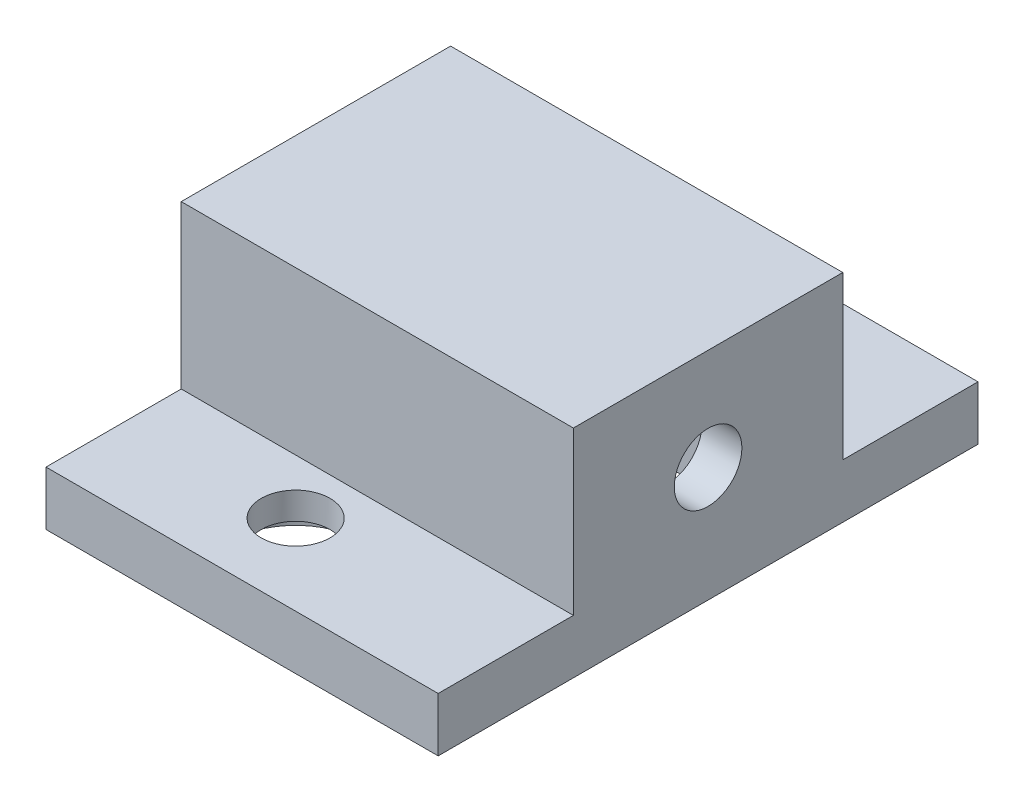
ISO-10303-21;
HEADER;
FILE_DESCRIPTION(('STEP AP214'),'2;1');
FILE_NAME('part.step','',(''),(''),'','','');
FILE_SCHEMA(('AUTOMOTIVE_DESIGN { 1 0 10303 214 1 1 1 1 }'));
ENDSEC;
DATA;
#1=APPLICATION_CONTEXT('core data for automotive mechanical design processes');
#2=APPLICATION_PROTOCOL_DEFINITION('international standard','automotive_design',2000,#1);
#3=PRODUCT_CONTEXT('',#1,'mechanical');
#4=PRODUCT('Part','Part','',(#3));
#5=PRODUCT_RELATED_PRODUCT_CATEGORY('part','',(#4));
#6=PRODUCT_DEFINITION_FORMATION('','',#4);
#7=PRODUCT_DEFINITION_CONTEXT('part definition',#1,'design');
#8=PRODUCT_DEFINITION('design','',#6,#7);
#9=PRODUCT_DEFINITION_SHAPE('','',#8);
#10=(LENGTH_UNIT() NAMED_UNIT(*) SI_UNIT(.MILLI.,.METRE.));
#11=(NAMED_UNIT(*) PLANE_ANGLE_UNIT() SI_UNIT($,.RADIAN.));
#12=(NAMED_UNIT(*) SI_UNIT($,.STERADIAN.) SOLID_ANGLE_UNIT());
#13=UNCERTAINTY_MEASURE_WITH_UNIT(LENGTH_MEASURE(1.E-05),#10,'distance_accuracy_value','');
#14=(GEOMETRIC_REPRESENTATION_CONTEXT(3) GLOBAL_UNCERTAINTY_ASSIGNED_CONTEXT((#13)) GLOBAL_UNIT_ASSIGNED_CONTEXT((#10,
#11,#12)) REPRESENTATION_CONTEXT('',''));
#15=CARTESIAN_POINT('',(0.,0.,0.));
#16=DIRECTION('',(0.,0.,1.));
#17=DIRECTION('',(1.,0.,0.));
#18=AXIS2_PLACEMENT_3D('',#15,#16,#17);
#19=CARTESIAN_POINT('',(0.,0.,0.));
#20=DIRECTION('',(0.,1.,0.));
#21=DIRECTION('',(0.,0.,1.));
#22=AXIS2_PLACEMENT_3D('',#19,#20,#21);
#23=PLANE('',#22);
#24=CARTESIAN_POINT('',(8.25,0.,-3.5));
#25=DIRECTION('',(0.,-1.,0.));
#26=DIRECTION('',(0.,0.,-1.));
#27=AXIS2_PLACEMENT_3D('',#24,#25,#26);
#28=CIRCLE('',#27,2.5);
#29=CARTESIAN_POINT('',(8.25,0.,-6.));
#30=VERTEX_POINT('',#29);
#31=EDGE_CURVE('E207',#30,#30,#28,.T.);
#32=ORIENTED_EDGE('',*,*,#31,.F.);
#33=EDGE_LOOP('',(#32));
#34=FACE_BOUND('',#33,.T.);
#35=CARTESIAN_POINT('',(8.25,0.,10.5));
#36=DIRECTION('',(0.,-1.,0.));
#37=DIRECTION('',(0.,0.,-1.));
#38=AXIS2_PLACEMENT_3D('',#35,#36,#37);
#39=CIRCLE('',#38,2.5);
#40=CARTESIAN_POINT('',(8.25,0.,8.));
#41=VERTEX_POINT('',#40);
#42=EDGE_CURVE('E211',#41,#41,#39,.T.);
#43=ORIENTED_EDGE('',*,*,#42,.F.);
#44=EDGE_LOOP('',(#43));
#45=FACE_BOUND('',#44,.T.);
#46=DIRECTION('',(0.,0.,1.));
#47=VECTOR('',#46,1.);
#48=CARTESIAN_POINT('',(2.,0.,0.));
#49=LINE('',#48,#47);
#50=CARTESIAN_POINT('',(2.,0.,-6.48));
#51=VERTEX_POINT('',#50);
#52=CARTESIAN_POINT('',(2.,0.,-0.02));
#53=VERTEX_POINT('',#52);
#54=EDGE_CURVE('E147',#51,#53,#49,.T.);
#55=ORIENTED_EDGE('',*,*,#54,.F.);
#56=DIRECTION('',(1.,0.,0.));
#57=VECTOR('',#56,1.);
#58=CARTESIAN_POINT('',(0.,0.,-6.48));
#59=LINE('',#58,#57);
#60=CARTESIAN_POINT('',(16.5,0.,-6.48));
#61=VERTEX_POINT('',#60);
#62=EDGE_CURVE('E226',#51,#61,#59,.T.);
#63=ORIENTED_EDGE('',*,*,#62,.T.);
#64=DIRECTION('',(0.,0.,-1.));
#65=VECTOR('',#64,1.);
#66=CARTESIAN_POINT('',(16.5,0.,-1.5));
#67=LINE('',#66,#65);
#68=CARTESIAN_POINT('',(16.5,0.,13.48));
#69=VERTEX_POINT('',#68);
#70=EDGE_CURVE('E172',#69,#61,#67,.T.);
#71=ORIENTED_EDGE('',*,*,#70,.F.);
#72=DIRECTION('',(-1.,0.,0.));
#73=VECTOR('',#72,1.);
#74=CARTESIAN_POINT('',(16.5,0.,13.48));
#75=LINE('',#74,#73);
#76=CARTESIAN_POINT('',(2.,0.,13.48));
#77=VERTEX_POINT('',#76);
#78=EDGE_CURVE('E143',#69,#77,#75,.T.);
#79=ORIENTED_EDGE('',*,*,#78,.T.);
#80=CARTESIAN_POINT('',(2.,0.,7.02));
#81=VERTEX_POINT('',#80);
#82=EDGE_CURVE('E134',#81,#77,#49,.T.);
#83=ORIENTED_EDGE('',*,*,#82,.F.);
#84=DIRECTION('',(-1.,0.,0.));
#85=VECTOR('',#84,1.);
#86=CARTESIAN_POINT('',(0.,0.,7.02));
#87=LINE('',#86,#85);
#88=CARTESIAN_POINT('',(15.02,0.,7.02));
#89=VERTEX_POINT('',#88);
#90=EDGE_CURVE('E54',#89,#81,#87,.T.);
#91=ORIENTED_EDGE('',*,*,#90,.F.);
#92=DIRECTION('',(0.,0.,-1.));
#93=VECTOR('',#92,1.);
#94=CARTESIAN_POINT('',(15.02,0.,-0.02));
#95=LINE('',#94,#93);
#96=CARTESIAN_POINT('',(15.02,0.,-0.02));
#97=VERTEX_POINT('',#96);
#98=EDGE_CURVE('E248',#89,#97,#95,.T.);
#99=ORIENTED_EDGE('',*,*,#98,.T.);
#100=DIRECTION('',(-1.,0.,0.));
#101=VECTOR('',#100,1.);
#102=CARTESIAN_POINT('',(-0.02,0.,-0.02));
#103=LINE('',#102,#101);
#104=EDGE_CURVE('E160',#97,#53,#103,.T.);
#105=ORIENTED_EDGE('',*,*,#104,.T.);
#106=EDGE_LOOP('',(#55,#63,#71,#79,#83,#91,#99,#105));
#107=FACE_BOUND('',#106,.T.);
#108=ADVANCED_FACE('F45',(#34,#45,#107),#23,.F.);
#109=CARTESIAN_POINT('',(0.,6.5,0.));
#110=DIRECTION('',(0.,1.,0.));
#111=DIRECTION('',(0.,0.,1.));
#112=AXIS2_PLACEMENT_3D('',#109,#110,#111);
#113=PLANE('',#112);
#114=DIRECTION('',(0.,0.,1.));
#115=VECTOR('',#114,1.);
#116=CARTESIAN_POINT('',(2.,6.5,0.));
#117=LINE('',#116,#115);
#118=CARTESIAN_POINT('',(2.,6.5,-0.02));
#119=VERTEX_POINT('',#118);
#120=CARTESIAN_POINT('',(2.,6.5,7.02));
#121=VERTEX_POINT('',#120);
#122=EDGE_CURVE('E61',#119,#121,#117,.T.);
#123=ORIENTED_EDGE('',*,*,#122,.F.);
#124=DIRECTION('',(1.,0.,0.));
#125=VECTOR('',#124,1.);
#126=CARTESIAN_POINT('',(-0.02,6.5,-0.02));
#127=LINE('',#126,#125);
#128=CARTESIAN_POINT('',(15.02,6.5,-0.02));
#129=VERTEX_POINT('',#128);
#130=EDGE_CURVE('E261',#119,#129,#127,.T.);
#131=ORIENTED_EDGE('',*,*,#130,.T.);
#132=DIRECTION('',(0.,0.,1.));
#133=VECTOR('',#132,1.);
#134=CARTESIAN_POINT('',(15.02,6.5,-0.02));
#135=LINE('',#134,#133);
#136=CARTESIAN_POINT('',(15.02,6.5,7.02));
#137=VERTEX_POINT('',#136);
#138=EDGE_CURVE('E257',#129,#137,#135,.T.);
#139=ORIENTED_EDGE('',*,*,#138,.T.);
#140=DIRECTION('',(-1.,0.,0.));
#141=VECTOR('',#140,1.);
#142=CARTESIAN_POINT('',(15.02,6.5,7.02));
#143=LINE('',#142,#141);
#144=EDGE_CURVE('E264',#137,#121,#143,.T.);
#145=ORIENTED_EDGE('',*,*,#144,.T.);
#146=EDGE_LOOP('',(#123,#131,#139,#145));
#147=FACE_BOUND('',#146,.T.);
#148=ADVANCED_FACE('F354',(#147),#113,.F.);
#149=CARTESIAN_POINT('',(0.,8.,0.));
#150=DIRECTION('',(0.,1.,0.));
#151=DIRECTION('',(0.,0.,1.));
#152=AXIS2_PLACEMENT_3D('',#149,#150,#151);
#153=PLANE('',#152);
#154=DIRECTION('',(1.,0.,0.));
#155=VECTOR('',#154,1.);
#156=CARTESIAN_POINT('',(0.,8.,-1.48));
#157=LINE('',#156,#155);
#158=CARTESIAN_POINT('',(2.,8.,-1.48));
#159=VERTEX_POINT('',#158);
#160=CARTESIAN_POINT('',(16.5,7.99999999999999,-1.48));
#161=VERTEX_POINT('',#160);
#162=EDGE_CURVE('E150',#159,#161,#157,.T.);
#163=ORIENTED_EDGE('',*,*,#162,.F.);
#164=DIRECTION('',(0.,0.,1.));
#165=VECTOR('',#164,1.);
#166=CARTESIAN_POINT('',(2.,8.,0.));
#167=LINE('',#166,#165);
#168=CARTESIAN_POINT('',(2.,7.99999999999999,8.48));
#169=VERTEX_POINT('',#168);
#170=EDGE_CURVE('E273',#159,#169,#167,.T.);
#171=ORIENTED_EDGE('',*,*,#170,.T.);
#172=DIRECTION('',(-1.,0.,0.));
#173=VECTOR('',#172,1.);
#174=CARTESIAN_POINT('',(0.,8.,8.48));
#175=LINE('',#174,#173);
#176=CARTESIAN_POINT('',(16.5,7.99999999999999,8.48));
#177=VERTEX_POINT('',#176);
#178=EDGE_CURVE('E153',#177,#169,#175,.T.);
#179=ORIENTED_EDGE('',*,*,#178,.F.);
#180=DIRECTION('',(0.,0.,-1.));
#181=VECTOR('',#180,1.);
#182=CARTESIAN_POINT('',(16.5,8.,8.5));
#183=LINE('',#182,#181);
#184=EDGE_CURVE('E187',#177,#161,#183,.T.);
#185=ORIENTED_EDGE('',*,*,#184,.T.);
#186=EDGE_LOOP('',(#163,#171,#179,#185));
#187=FACE_BOUND('',#186,.T.);
#188=ADVANCED_FACE('F356',(#187),#153,.T.);
#189=CARTESIAN_POINT('',(0.,2.,0.));
#190=DIRECTION('',(0.,1.,0.));
#191=DIRECTION('',(0.,0.,1.));
#192=AXIS2_PLACEMENT_3D('',#189,#190,#191);
#193=PLANE('',#192);
#194=CARTESIAN_POINT('',(8.25,2.,-3.5));
#195=DIRECTION('',(0.,1.,0.));
#196=DIRECTION('',(0.,0.,1.));
#197=AXIS2_PLACEMENT_3D('',#194,#195,#196);
#198=CIRCLE('',#197,1.27);
#199=CARTESIAN_POINT('',(8.25,2.,-2.23000000000001));
#200=VERTEX_POINT('',#199);
#201=EDGE_CURVE('E177',#200,#200,#198,.T.);
#202=ORIENTED_EDGE('',*,*,#201,.F.);
#203=EDGE_LOOP('',(#202));
#204=FACE_BOUND('',#203,.T.);
#205=DIRECTION('',(1.,0.,0.));
#206=VECTOR('',#205,1.);
#207=CARTESIAN_POINT('',(0.,2.,-6.48));
#208=LINE('',#207,#206);
#209=CARTESIAN_POINT('',(2.,2.,-6.48));
#210=VERTEX_POINT('',#209);
#211=CARTESIAN_POINT('',(16.5,2.,-6.48));
#212=VERTEX_POINT('',#211);
#213=EDGE_CURVE('E165',#210,#212,#208,.T.);
#214=ORIENTED_EDGE('',*,*,#213,.F.);
#215=DIRECTION('',(0.,0.,1.));
#216=VECTOR('',#215,1.);
#217=CARTESIAN_POINT('',(2.,2.,0.));
#218=LINE('',#217,#216);
#219=CARTESIAN_POINT('',(2.,2.,-1.48));
#220=VERTEX_POINT('',#219);
#221=EDGE_CURVE('E277',#210,#220,#218,.T.);
#222=ORIENTED_EDGE('',*,*,#221,.T.);
#223=DIRECTION('',(-1.,0.,0.));
#224=VECTOR('',#223,1.);
#225=CARTESIAN_POINT('',(16.5,2.,-1.48));
#226=LINE('',#225,#224);
#227=CARTESIAN_POINT('',(16.5,2.,-1.48));
#228=VERTEX_POINT('',#227);
#229=EDGE_CURVE('E230',#228,#220,#226,.T.);
#230=ORIENTED_EDGE('',*,*,#229,.F.);
#231=DIRECTION('',(0.,0.,1.));
#232=VECTOR('',#231,1.);
#233=CARTESIAN_POINT('',(16.5,2.,-1.5));
#234=LINE('',#233,#232);
#235=EDGE_CURVE('E196',#212,#228,#234,.T.);
#236=ORIENTED_EDGE('',*,*,#235,.F.);
#237=EDGE_LOOP('',(#214,#222,#230,#236));
#238=FACE_BOUND('',#237,.T.);
#239=ADVANCED_FACE('F362',(#204,#238),#193,.T.);
#240=CARTESIAN_POINT('',(0.,2.,0.));
#241=DIRECTION('',(0.,1.,0.));
#242=DIRECTION('',(0.,0.,1.));
#243=AXIS2_PLACEMENT_3D('',#240,#241,#242);
#244=PLANE('',#243);
#245=CARTESIAN_POINT('',(8.25,2.,10.5));
#246=DIRECTION('',(0.,1.,0.));
#247=DIRECTION('',(0.,0.,1.));
#248=AXIS2_PLACEMENT_3D('',#245,#246,#247);
#249=CIRCLE('',#248,1.27);
#250=CARTESIAN_POINT('',(8.25,2.,11.77));
#251=VERTEX_POINT('',#250);
#252=EDGE_CURVE('E178',#251,#251,#249,.T.);
#253=ORIENTED_EDGE('',*,*,#252,.F.);
#254=EDGE_LOOP('',(#253));
#255=FACE_BOUND('',#254,.T.);
#256=DIRECTION('',(1.,0.,0.));
#257=VECTOR('',#256,1.);
#258=CARTESIAN_POINT('',(0.,2.,8.48));
#259=LINE('',#258,#257);
#260=CARTESIAN_POINT('',(2.,2.,8.48));
#261=VERTEX_POINT('',#260);
#262=CARTESIAN_POINT('',(16.5,1.99999999999999,8.48));
#263=VERTEX_POINT('',#262);
#264=EDGE_CURVE('E159',#261,#263,#259,.T.);
#265=ORIENTED_EDGE('',*,*,#264,.F.);
#266=DIRECTION('',(0.,0.,1.));
#267=VECTOR('',#266,1.);
#268=CARTESIAN_POINT('',(2.,2.,0.));
#269=LINE('',#268,#267);
#270=CARTESIAN_POINT('',(2.,2.,13.48));
#271=VERTEX_POINT('',#270);
#272=EDGE_CURVE('E287',#261,#271,#269,.T.);
#273=ORIENTED_EDGE('',*,*,#272,.T.);
#274=DIRECTION('',(-1.,0.,0.));
#275=VECTOR('',#274,1.);
#276=CARTESIAN_POINT('',(0.,2.,13.48));
#277=LINE('',#276,#275);
#278=CARTESIAN_POINT('',(16.5,2.,13.48));
#279=VERTEX_POINT('',#278);
#280=EDGE_CURVE('E168',#279,#271,#277,.T.);
#281=ORIENTED_EDGE('',*,*,#280,.F.);
#282=DIRECTION('',(0.,0.,1.));
#283=VECTOR('',#282,1.);
#284=CARTESIAN_POINT('',(16.5,2.,13.5));
#285=LINE('',#284,#283);
#286=EDGE_CURVE('E195',#263,#279,#285,.T.);
#287=ORIENTED_EDGE('',*,*,#286,.F.);
#288=EDGE_LOOP('',(#265,#273,#281,#287));
#289=FACE_BOUND('',#288,.T.);
#290=ADVANCED_FACE('F373',(#255,#289),#244,.T.);
#291=CARTESIAN_POINT('',(16.5,0.,13.48));
#292=DIRECTION('',(0.,0.,-1.));
#293=DIRECTION('',(-1.,0.,0.));
#294=AXIS2_PLACEMENT_3D('',#291,#292,#293);
#295=PLANE('',#294);
#296=DIRECTION('',(0.,1.,0.));
#297=VECTOR('',#296,1.);
#298=CARTESIAN_POINT('',(2.,0.,13.48));
#299=LINE('',#298,#297);
#300=EDGE_CURVE('E291',#77,#271,#299,.T.);
#301=ORIENTED_EDGE('',*,*,#300,.F.);
#302=ORIENTED_EDGE('',*,*,#78,.F.);
#303=DIRECTION('',(0.,1.,0.));
#304=VECTOR('',#303,1.);
#305=CARTESIAN_POINT('',(16.5,0.,13.48));
#306=LINE('',#305,#304);
#307=EDGE_CURVE('E227',#69,#279,#306,.T.);
#308=ORIENTED_EDGE('',*,*,#307,.T.);
#309=ORIENTED_EDGE('',*,*,#280,.T.);
#310=EDGE_LOOP('',(#301,#302,#308,#309));
#311=FACE_BOUND('',#310,.T.);
#312=ADVANCED_FACE('F377',(#311),#295,.F.);
#313=CARTESIAN_POINT('',(0.,0.,-6.48));
#314=DIRECTION('',(0.,0.,1.));
#315=DIRECTION('',(1.,0.,0.));
#316=AXIS2_PLACEMENT_3D('',#313,#314,#315);
#317=PLANE('',#316);
#318=DIRECTION('',(0.,-1.,0.));
#319=VECTOR('',#318,1.);
#320=CARTESIAN_POINT('',(2.,0.,-6.48));
#321=LINE('',#320,#319);
#322=EDGE_CURVE('E281',#210,#51,#321,.T.);
#323=ORIENTED_EDGE('',*,*,#322,.F.);
#324=ORIENTED_EDGE('',*,*,#213,.T.);
#325=DIRECTION('',(0.,1.,0.));
#326=VECTOR('',#325,1.);
#327=CARTESIAN_POINT('',(16.5,0.,-6.48));
#328=LINE('',#327,#326);
#329=EDGE_CURVE('E183',#61,#212,#328,.T.);
#330=ORIENTED_EDGE('',*,*,#329,.F.);
#331=ORIENTED_EDGE('',*,*,#62,.F.);
#332=EDGE_LOOP('',(#323,#324,#330,#331));
#333=FACE_BOUND('',#332,.T.);
#334=ADVANCED_FACE('F405',(#333),#317,.F.);
#335=CARTESIAN_POINT('',(0.,-14.5000121212077,8.48));
#336=DIRECTION('',(0.,0.,-1.));
#337=DIRECTION('',(-1.,0.,0.));
#338=AXIS2_PLACEMENT_3D('',#335,#336,#337);
#339=PLANE('',#338);
#340=DIRECTION('',(0.,1.,0.));
#341=VECTOR('',#340,1.);
#342=CARTESIAN_POINT('',(2.,-14.5000121212077,8.48));
#343=LINE('',#342,#341);
#344=EDGE_CURVE('E284',#261,#169,#343,.T.);
#345=ORIENTED_EDGE('',*,*,#344,.F.);
#346=ORIENTED_EDGE('',*,*,#264,.T.);
#347=DIRECTION('',(0.,1.,0.));
#348=VECTOR('',#347,1.);
#349=CARTESIAN_POINT('',(16.5,-14.5000121212077,8.48));
#350=LINE('',#349,#348);
#351=EDGE_CURVE('E238',#263,#177,#350,.T.);
#352=ORIENTED_EDGE('',*,*,#351,.T.);
#353=ORIENTED_EDGE('',*,*,#178,.T.);
#354=EDGE_LOOP('',(#345,#346,#352,#353));
#355=FACE_BOUND('',#354,.T.);
#356=ADVANCED_FACE('F409',(#355),#339,.F.);
#357=CARTESIAN_POINT('',(16.5,-14.5000121212077,-1.48));
#358=DIRECTION('',(0.,0.,1.));
#359=DIRECTION('',(1.,0.,0.));
#360=AXIS2_PLACEMENT_3D('',#357,#358,#359);
#361=PLANE('',#360);
#362=DIRECTION('',(0.,-1.,0.));
#363=VECTOR('',#362,1.);
#364=CARTESIAN_POINT('',(2.,-14.5000121212077,-1.48));
#365=LINE('',#364,#363);
#366=EDGE_CURVE('E267',#159,#220,#365,.T.);
#367=ORIENTED_EDGE('',*,*,#366,.F.);
#368=ORIENTED_EDGE('',*,*,#162,.T.);
#369=DIRECTION('',(0.,1.,0.));
#370=VECTOR('',#369,1.);
#371=CARTESIAN_POINT('',(16.5,-14.5000121212077,-1.48));
#372=LINE('',#371,#370);
#373=EDGE_CURVE('E241',#228,#161,#372,.T.);
#374=ORIENTED_EDGE('',*,*,#373,.F.);
#375=ORIENTED_EDGE('',*,*,#229,.T.);
#376=EDGE_LOOP('',(#367,#368,#374,#375));
#377=FACE_BOUND('',#376,.T.);
#378=ADVANCED_FACE('F413',(#377),#361,.F.);
#379=CARTESIAN_POINT('',(-0.02,-16.6061193540213,-0.02));
#380=DIRECTION('',(0.,0.,1.));
#381=DIRECTION('',(1.,0.,0.));
#382=AXIS2_PLACEMENT_3D('',#379,#380,#381);
#383=PLANE('',#382);
#384=ORIENTED_EDGE('',*,*,#130,.F.);
#385=DIRECTION('',(0.,-1.,0.));
#386=VECTOR('',#385,1.);
#387=CARTESIAN_POINT('',(2.,-16.6061193540213,-0.02));
#388=LINE('',#387,#386);
#389=EDGE_CURVE('E145',#119,#53,#388,.T.);
#390=ORIENTED_EDGE('',*,*,#389,.T.);
#391=ORIENTED_EDGE('',*,*,#104,.F.);
#392=DIRECTION('',(0.,1.,0.));
#393=VECTOR('',#392,1.);
#394=CARTESIAN_POINT('',(15.02,-16.6061193540213,-0.02));
#395=LINE('',#394,#393);
#396=EDGE_CURVE('E251',#97,#129,#395,.T.);
#397=ORIENTED_EDGE('',*,*,#396,.T.);
#398=EDGE_LOOP('',(#384,#390,#391,#397));
#399=FACE_BOUND('',#398,.T.);
#400=ADVANCED_FACE('F347',(#399),#383,.T.);
#401=CARTESIAN_POINT('',(15.02,-16.6061193540213,7.02));
#402=DIRECTION('',(0.,0.,-1.));
#403=DIRECTION('',(-1.,0.,0.));
#404=AXIS2_PLACEMENT_3D('',#401,#402,#403);
#405=PLANE('',#404);
#406=ORIENTED_EDGE('',*,*,#90,.T.);
#407=DIRECTION('',(0.,1.,0.));
#408=VECTOR('',#407,1.);
#409=CARTESIAN_POINT('',(2.,-16.6061193540213,7.02));
#410=LINE('',#409,#408);
#411=EDGE_CURVE('E11',#81,#121,#410,.T.);
#412=ORIENTED_EDGE('',*,*,#411,.T.);
#413=ORIENTED_EDGE('',*,*,#144,.F.);
#414=DIRECTION('',(0.,1.,0.));
#415=VECTOR('',#414,1.);
#416=CARTESIAN_POINT('',(15.02,-16.6061193540213,7.02));
#417=LINE('',#416,#415);
#418=EDGE_CURVE('E68',#89,#137,#417,.T.);
#419=ORIENTED_EDGE('',*,*,#418,.F.);
#420=EDGE_LOOP('',(#406,#412,#413,#419));
#421=FACE_BOUND('',#420,.T.);
#422=ADVANCED_FACE('F148',(#421),#405,.T.);
#423=CARTESIAN_POINT('',(0.,4.25,3.5));
#424=DIRECTION('',(1.,0.,0.));
#425=DIRECTION('',(0.,0.,-1.));
#426=AXIS2_PLACEMENT_3D('',#423,#424,#425);
#427=CYLINDRICAL_SURFACE('',#426,1.25);
#428=CARTESIAN_POINT('',(16.5,4.25,3.5));
#429=DIRECTION('',(1.,0.,0.));
#430=DIRECTION('',(0.,0.,-1.));
#431=AXIS2_PLACEMENT_3D('',#428,#429,#430);
#432=CIRCLE('',#431,1.25);
#433=CARTESIAN_POINT('',(16.5,4.25,2.25));
#434=VERTEX_POINT('',#433);
#435=EDGE_CURVE('E191',#434,#434,#432,.T.);
#436=ORIENTED_EDGE('',*,*,#435,.T.);
#437=EDGE_LOOP('',(#436));
#438=FACE_BOUND('',#437,.T.);
#439=CARTESIAN_POINT('',(15.02,4.25,3.5));
#440=DIRECTION('',(-1.,0.,0.));
#441=DIRECTION('',(0.,0.,1.));
#442=AXIS2_PLACEMENT_3D('',#439,#440,#441);
#443=CIRCLE('',#442,1.25);
#444=CARTESIAN_POINT('',(15.02,4.25,4.75));
#445=VERTEX_POINT('',#444);
#446=EDGE_CURVE('E156',#445,#445,#443,.F.);
#447=ORIENTED_EDGE('',*,*,#446,.F.);
#448=EDGE_LOOP('',(#447));
#449=FACE_BOUND('',#448,.T.);
#450=ADVANCED_FACE('F367',(#438,#449),#427,.F.);
#451=CARTESIAN_POINT('',(16.5,6.5,-1.5));
#452=DIRECTION('',(-1.,0.,0.));
#453=DIRECTION('',(0.,0.,1.));
#454=AXIS2_PLACEMENT_3D('',#451,#452,#453);
#455=PLANE('',#454);
#456=ORIENTED_EDGE('',*,*,#435,.F.);
#457=EDGE_LOOP('',(#456));
#458=FACE_BOUND('',#457,.T.);
#459=ORIENTED_EDGE('',*,*,#235,.T.);
#460=ORIENTED_EDGE('',*,*,#373,.T.);
#461=ORIENTED_EDGE('',*,*,#184,.F.);
#462=ORIENTED_EDGE('',*,*,#351,.F.);
#463=ORIENTED_EDGE('',*,*,#286,.T.);
#464=ORIENTED_EDGE('',*,*,#307,.F.);
#465=ORIENTED_EDGE('',*,*,#70,.T.);
#466=ORIENTED_EDGE('',*,*,#329,.T.);
#467=EDGE_LOOP('',(#459,#460,#461,#462,#463,#464,#465,#466));
#468=FACE_BOUND('',#467,.T.);
#469=ADVANCED_FACE('F47',(#458,#468),#455,.F.);
#470=CARTESIAN_POINT('',(8.25,1.,-3.5));
#471=DIRECTION('',(0.,-1.,0.));
#472=DIRECTION('',(0.,0.,-1.));
#473=AXIS2_PLACEMENT_3D('',#470,#471,#472);
#474=PLANE('',#473);
#475=CARTESIAN_POINT('',(8.25,1.,-3.5));
#476=DIRECTION('',(0.,-1.,0.));
#477=DIRECTION('',(0.,0.,-1.));
#478=AXIS2_PLACEMENT_3D('',#475,#476,#477);
#479=CIRCLE('',#478,1.27);
#480=CARTESIAN_POINT('',(8.25,1.,-4.77));
#481=VERTEX_POINT('',#480);
#482=EDGE_CURVE('E173',#481,#481,#479,.T.);
#483=ORIENTED_EDGE('',*,*,#482,.F.);
#484=EDGE_LOOP('',(#483));
#485=FACE_BOUND('',#484,.T.);
#486=CARTESIAN_POINT('',(8.25,1.,-3.5));
#487=DIRECTION('',(0.,-1.,0.));
#488=DIRECTION('',(0.,0.,-1.));
#489=AXIS2_PLACEMENT_3D('',#486,#487,#488);
#490=CIRCLE('',#489,2.5);
#491=CARTESIAN_POINT('',(8.25,1.,-6.));
#492=VERTEX_POINT('',#491);
#493=EDGE_CURVE('E203',#492,#492,#490,.T.);
#494=ORIENTED_EDGE('',*,*,#493,.T.);
#495=EDGE_LOOP('',(#494));
#496=FACE_BOUND('',#495,.T.);
#497=ADVANCED_FACE('F379',(#485,#496),#474,.T.);
#498=CARTESIAN_POINT('',(8.25,1.,-3.5));
#499=DIRECTION('',(0.,-1.,0.));
#500=DIRECTION('',(0.,0.,-1.));
#501=AXIS2_PLACEMENT_3D('',#498,#499,#500);
#502=CYLINDRICAL_SURFACE('',#501,2.5);
#503=ORIENTED_EDGE('',*,*,#493,.F.);
#504=EDGE_LOOP('',(#503));
#505=FACE_BOUND('',#504,.T.);
#506=ORIENTED_EDGE('',*,*,#31,.T.);
#507=EDGE_LOOP('',(#506));
#508=FACE_BOUND('',#507,.T.);
#509=ADVANCED_FACE('F382',(#505,#508),#502,.F.);
#510=CARTESIAN_POINT('',(8.25,1.,10.5));
#511=DIRECTION('',(0.,-1.,0.));
#512=DIRECTION('',(0.,0.,-1.));
#513=AXIS2_PLACEMENT_3D('',#510,#511,#512);
#514=PLANE('',#513);
#515=CARTESIAN_POINT('',(8.25,1.,10.5));
#516=DIRECTION('',(0.,-1.,0.));
#517=DIRECTION('',(0.,0.,-1.));
#518=AXIS2_PLACEMENT_3D('',#515,#516,#517);
#519=CIRCLE('',#518,1.27);
#520=CARTESIAN_POINT('',(8.25,1.,9.23000000000001));
#521=VERTEX_POINT('',#520);
#522=EDGE_CURVE('E179',#521,#521,#519,.T.);
#523=ORIENTED_EDGE('',*,*,#522,.F.);
#524=EDGE_LOOP('',(#523));
#525=FACE_BOUND('',#524,.T.);
#526=CARTESIAN_POINT('',(8.25,1.,10.5));
#527=DIRECTION('',(0.,-1.,0.));
#528=DIRECTION('',(0.,0.,-1.));
#529=AXIS2_PLACEMENT_3D('',#526,#527,#528);
#530=CIRCLE('',#529,2.5);
#531=CARTESIAN_POINT('',(8.25,1.,8.));
#532=VERTEX_POINT('',#531);
#533=EDGE_CURVE('E199',#532,#532,#530,.T.);
#534=ORIENTED_EDGE('',*,*,#533,.T.);
#535=EDGE_LOOP('',(#534));
#536=FACE_BOUND('',#535,.T.);
#537=ADVANCED_FACE('F386',(#525,#536),#514,.T.);
#538=CARTESIAN_POINT('',(8.25,1.,10.5));
#539=DIRECTION('',(0.,-1.,0.));
#540=DIRECTION('',(0.,0.,-1.));
#541=AXIS2_PLACEMENT_3D('',#538,#539,#540);
#542=CYLINDRICAL_SURFACE('',#541,2.5);
#543=ORIENTED_EDGE('',*,*,#533,.F.);
#544=EDGE_LOOP('',(#543));
#545=FACE_BOUND('',#544,.T.);
#546=ORIENTED_EDGE('',*,*,#42,.T.);
#547=EDGE_LOOP('',(#546));
#548=FACE_BOUND('',#547,.T.);
#549=ADVANCED_FACE('F388',(#545,#548),#542,.F.);
#550=CARTESIAN_POINT('',(8.25,0.,10.5));
#551=DIRECTION('',(0.,1.,0.));
#552=DIRECTION('',(0.,0.,1.));
#553=AXIS2_PLACEMENT_3D('',#550,#551,#552);
#554=CYLINDRICAL_SURFACE('',#553,1.27);
#555=ORIENTED_EDGE('',*,*,#252,.T.);
#556=EDGE_LOOP('',(#555));
#557=FACE_BOUND('',#556,.T.);
#558=ORIENTED_EDGE('',*,*,#522,.T.);
#559=EDGE_LOOP('',(#558));
#560=FACE_BOUND('',#559,.T.);
#561=ADVANCED_FACE('F391',(#557,#560),#554,.F.);
#562=CARTESIAN_POINT('',(8.25,0.,-3.5));
#563=DIRECTION('',(0.,1.,0.));
#564=DIRECTION('',(0.,0.,1.));
#565=AXIS2_PLACEMENT_3D('',#562,#563,#564);
#566=CYLINDRICAL_SURFACE('',#565,1.27);
#567=ORIENTED_EDGE('',*,*,#201,.T.);
#568=EDGE_LOOP('',(#567));
#569=FACE_BOUND('',#568,.T.);
#570=ORIENTED_EDGE('',*,*,#482,.T.);
#571=EDGE_LOOP('',(#570));
#572=FACE_BOUND('',#571,.T.);
#573=ADVANCED_FACE('F396',(#569,#572),#566,.F.);
#574=CARTESIAN_POINT('',(15.02,-16.6061193540213,-0.02));
#575=DIRECTION('',(-1.,0.,0.));
#576=DIRECTION('',(0.,0.,1.));
#577=AXIS2_PLACEMENT_3D('',#574,#575,#576);
#578=PLANE('',#577);
#579=ORIENTED_EDGE('',*,*,#418,.T.);
#580=ORIENTED_EDGE('',*,*,#138,.F.);
#581=ORIENTED_EDGE('',*,*,#396,.F.);
#582=ORIENTED_EDGE('',*,*,#98,.F.);
#583=EDGE_LOOP('',(#579,#580,#581,#582));
#584=FACE_BOUND('',#583,.T.);
#585=ORIENTED_EDGE('',*,*,#446,.T.);
#586=EDGE_LOOP('',(#585));
#587=FACE_BOUND('',#586,.T.);
#588=ADVANCED_FACE('F350',(#584,#587),#578,.T.);
#589=CARTESIAN_POINT('',(2.,0.,0.));
#590=DIRECTION('',(-1.,0.,0.));
#591=DIRECTION('',(0.,0.,1.));
#592=AXIS2_PLACEMENT_3D('',#589,#590,#591);
#593=PLANE('',#592);
#594=ORIENTED_EDGE('',*,*,#366,.T.);
#595=ORIENTED_EDGE('',*,*,#221,.F.);
#596=ORIENTED_EDGE('',*,*,#322,.T.);
#597=ORIENTED_EDGE('',*,*,#54,.T.);
#598=ORIENTED_EDGE('',*,*,#389,.F.);
#599=ORIENTED_EDGE('',*,*,#122,.T.);
#600=ORIENTED_EDGE('',*,*,#411,.F.);
#601=ORIENTED_EDGE('',*,*,#82,.T.);
#602=ORIENTED_EDGE('',*,*,#300,.T.);
#603=ORIENTED_EDGE('',*,*,#272,.F.);
#604=ORIENTED_EDGE('',*,*,#344,.T.);
#605=ORIENTED_EDGE('',*,*,#170,.F.);
#606=EDGE_LOOP('',(#594,#595,#596,#597,#598,#599,#600,#601,#602,#603,#604,#605));
#607=FACE_BOUND('',#606,.T.);
#608=ADVANCED_FACE('F133',(#607),#593,.T.);
#609=CLOSED_SHELL('',(#108,#148,#188,#239,#290,#312,#334,#356,#378,#400,#422,#450,#469,#497,
#509,#537,#549,#561,#573,#588,#608));
#610=MANIFOLD_SOLID_BREP('B2',#609);
#611=ADVANCED_BREP_SHAPE_REPRESENTATION('',(#18,#610),#14);
#612=SHAPE_DEFINITION_REPRESENTATION(#9,#611);
ENDSEC;
END-ISO-10303-21;
